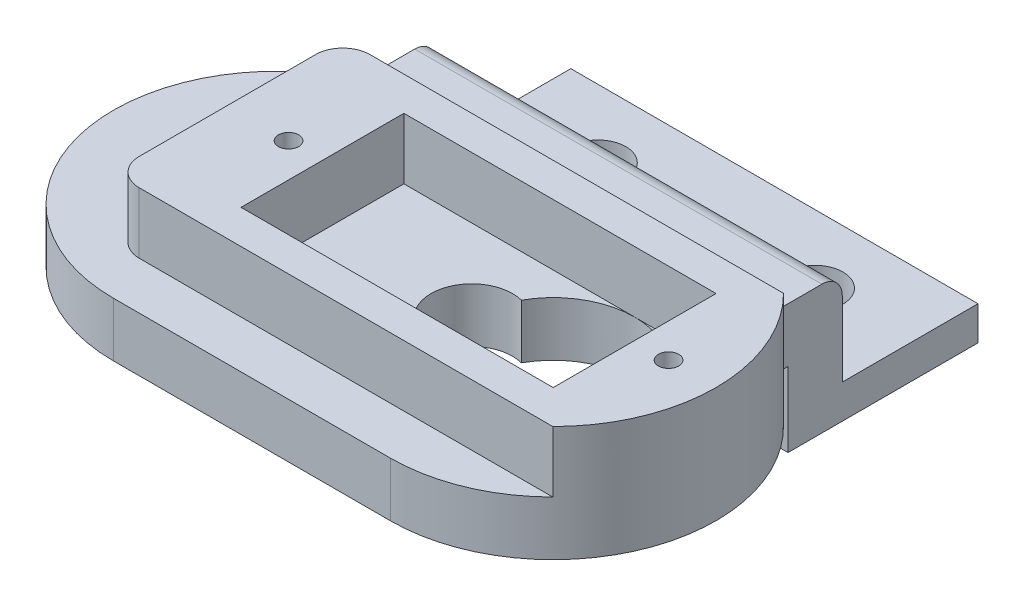
ISO-10303-21;
HEADER;
FILE_DESCRIPTION(('STEP AP214'),'2;1');
FILE_NAME('part.step','',(''),(''),'','','');
FILE_SCHEMA(('AUTOMOTIVE_DESIGN { 1 0 10303 214 1 1 1 1 }'));
ENDSEC;
DATA;
#1=APPLICATION_CONTEXT('core data for automotive mechanical design processes');
#2=APPLICATION_PROTOCOL_DEFINITION('international standard','automotive_design',2000,#1);
#3=PRODUCT_CONTEXT('',#1,'mechanical');
#4=PRODUCT('Part','Part','',(#3));
#5=PRODUCT_RELATED_PRODUCT_CATEGORY('part','',(#4));
#6=PRODUCT_DEFINITION_FORMATION('','',#4);
#7=PRODUCT_DEFINITION_CONTEXT('part definition',#1,'design');
#8=PRODUCT_DEFINITION('design','',#6,#7);
#9=PRODUCT_DEFINITION_SHAPE('','',#8);
#10=(LENGTH_UNIT() NAMED_UNIT(*) SI_UNIT(.MILLI.,.METRE.));
#11=(NAMED_UNIT(*) PLANE_ANGLE_UNIT() SI_UNIT($,.RADIAN.));
#12=(NAMED_UNIT(*) SI_UNIT($,.STERADIAN.) SOLID_ANGLE_UNIT());
#13=UNCERTAINTY_MEASURE_WITH_UNIT(LENGTH_MEASURE(1.E-05),#10,'distance_accuracy_value','');
#14=(GEOMETRIC_REPRESENTATION_CONTEXT(3) GLOBAL_UNCERTAINTY_ASSIGNED_CONTEXT((#13)) GLOBAL_UNIT_ASSIGNED_CONTEXT((#10,
#11,#12)) REPRESENTATION_CONTEXT('',''));
#15=CARTESIAN_POINT('',(0.,0.,0.));
#16=DIRECTION('',(0.,0.,1.));
#17=DIRECTION('',(1.,0.,0.));
#18=AXIS2_PLACEMENT_3D('',#15,#16,#17);
#19=CARTESIAN_POINT('',(0.,-5.5,0.));
#20=DIRECTION('',(0.,-1.,0.));
#21=DIRECTION('',(0.,0.,-1.));
#22=AXIS2_PLACEMENT_3D('',#19,#20,#21);
#23=PLANE('',#22);
#24=CARTESIAN_POINT('',(8.,-5.5,-21.5));
#25=DIRECTION('',(0.,-1.,0.));
#26=DIRECTION('',(0.,0.,-1.));
#27=AXIS2_PLACEMENT_3D('',#24,#25,#26);
#28=CIRCLE('',#27,2.05);
#29=CARTESIAN_POINT('',(8.,-5.5,-23.55));
#30=VERTEX_POINT('',#29);
#31=EDGE_CURVE('E862',#30,#30,#28,.F.);
#32=ORIENTED_EDGE('',*,*,#31,.T.);
#33=EDGE_LOOP('',(#32));
#34=FACE_BOUND('',#33,.T.);
#35=DIRECTION('',(1.,0.,0.));
#36=VECTOR('',#35,1.);
#37=CARTESIAN_POINT('',(0.,-5.5,-12.5));
#38=LINE('',#37,#36);
#39=CARTESIAN_POINT('',(-15.,-5.5,-12.5));
#40=VERTEX_POINT('',#39);
#41=CARTESIAN_POINT('',(15.,-5.5,-12.5));
#42=VERTEX_POINT('',#41);
#43=EDGE_CURVE('E236',#40,#42,#38,.T.);
#44=ORIENTED_EDGE('',*,*,#43,.F.);
#45=DIRECTION('',(0.,0.,-1.));
#46=VECTOR('',#45,1.);
#47=CARTESIAN_POINT('',(-15.,-5.5,0.));
#48=LINE('',#47,#46);
#49=CARTESIAN_POINT('',(-15.,-5.5,-26.5));
#50=VERTEX_POINT('',#49);
#51=EDGE_CURVE('E239',#40,#50,#48,.T.);
#52=ORIENTED_EDGE('',*,*,#51,.T.);
#53=DIRECTION('',(-1.,0.,0.));
#54=VECTOR('',#53,1.);
#55=CARTESIAN_POINT('',(0.,-5.5,-26.5));
#56=LINE('',#55,#54);
#57=CARTESIAN_POINT('',(15.,-5.5,-26.5));
#58=VERTEX_POINT('',#57);
#59=EDGE_CURVE('E221',#58,#50,#56,.T.);
#60=ORIENTED_EDGE('',*,*,#59,.F.);
#61=DIRECTION('',(0.,0.,1.));
#62=VECTOR('',#61,1.);
#63=CARTESIAN_POINT('',(15.,-5.5,0.));
#64=LINE('',#63,#62);
#65=EDGE_CURVE('E217',#58,#42,#64,.T.);
#66=ORIENTED_EDGE('',*,*,#65,.T.);
#67=EDGE_LOOP('',(#44,#52,#60,#66));
#68=FACE_BOUND('',#67,.T.);
#69=CARTESIAN_POINT('',(-8.,-5.5,-21.5));
#70=DIRECTION('',(0.,-1.,0.));
#71=DIRECTION('',(0.,0.,-1.));
#72=AXIS2_PLACEMENT_3D('',#69,#70,#71);
#73=CIRCLE('',#72,2.05);
#74=CARTESIAN_POINT('',(-8.,-5.5,-23.55));
#75=VERTEX_POINT('',#74);
#76=EDGE_CURVE('E228',#75,#75,#73,.T.);
#77=ORIENTED_EDGE('',*,*,#76,.F.);
#78=EDGE_LOOP('',(#77));
#79=FACE_BOUND('',#78,.T.);
#80=ADVANCED_FACE('F37',(#34,#68,#79),#23,.T.);
#81=CARTESIAN_POINT('',(0.,-3.,-26.5));
#82=DIRECTION('',(0.,1.,0.));
#83=DIRECTION('',(0.,0.,1.));
#84=AXIS2_PLACEMENT_3D('',#81,#82,#83);
#85=PLANE('',#84);
#86=CARTESIAN_POINT('',(8.,-3.,-21.5));
#87=DIRECTION('',(0.,-1.,0.));
#88=DIRECTION('',(0.,0.,-1.));
#89=AXIS2_PLACEMENT_3D('',#86,#87,#88);
#90=CIRCLE('',#89,2.05);
#91=CARTESIAN_POINT('',(8.,-3.,-23.55));
#92=VERTEX_POINT('',#91);
#93=EDGE_CURVE('E865',#92,#92,#90,.T.);
#94=ORIENTED_EDGE('',*,*,#93,.T.);
#95=EDGE_LOOP('',(#94));
#96=FACE_BOUND('',#95,.T.);
#97=DIRECTION('',(-1.,0.,0.));
#98=VECTOR('',#97,1.);
#99=CARTESIAN_POINT('',(0.,-3.,-16.5));
#100=LINE('',#99,#98);
#101=CARTESIAN_POINT('',(15.,-3.,-16.5));
#102=VERTEX_POINT('',#101);
#103=CARTESIAN_POINT('',(-15.,-3.,-16.5));
#104=VERTEX_POINT('',#103);
#105=EDGE_CURVE('E208',#102,#104,#100,.T.);
#106=ORIENTED_EDGE('',*,*,#105,.F.);
#107=DIRECTION('',(0.,0.,1.));
#108=VECTOR('',#107,1.);
#109=CARTESIAN_POINT('',(15.,-3.,-26.5));
#110=LINE('',#109,#108);
#111=CARTESIAN_POINT('',(15.,-3.,-26.5));
#112=VERTEX_POINT('',#111);
#113=EDGE_CURVE('E200',#112,#102,#110,.T.);
#114=ORIENTED_EDGE('',*,*,#113,.F.);
#115=DIRECTION('',(-1.,0.,0.));
#116=VECTOR('',#115,1.);
#117=CARTESIAN_POINT('',(0.,-3.,-26.5));
#118=LINE('',#117,#116);
#119=CARTESIAN_POINT('',(-15.,-3.,-26.5));
#120=VERTEX_POINT('',#119);
#121=EDGE_CURVE('E206',#112,#120,#118,.T.);
#122=ORIENTED_EDGE('',*,*,#121,.T.);
#123=DIRECTION('',(0.,0.,1.));
#124=VECTOR('',#123,1.);
#125=CARTESIAN_POINT('',(-15.,-3.,-26.5));
#126=LINE('',#125,#124);
#127=EDGE_CURVE('E211',#120,#104,#126,.T.);
#128=ORIENTED_EDGE('',*,*,#127,.T.);
#129=EDGE_LOOP('',(#106,#114,#122,#128));
#130=FACE_BOUND('',#129,.T.);
#131=CARTESIAN_POINT('',(-8.,-3.,-21.5));
#132=DIRECTION('',(0.,1.,0.));
#133=DIRECTION('',(0.,0.,1.));
#134=AXIS2_PLACEMENT_3D('',#131,#132,#133);
#135=CIRCLE('',#134,2.05);
#136=CARTESIAN_POINT('',(-8.,-3.,-19.45));
#137=VERTEX_POINT('',#136);
#138=EDGE_CURVE('E866',#137,#137,#135,.T.);
#139=ORIENTED_EDGE('',*,*,#138,.F.);
#140=EDGE_LOOP('',(#139));
#141=FACE_BOUND('',#140,.T.);
#142=ADVANCED_FACE('F202',(#96,#130,#141),#85,.T.);
#143=CARTESIAN_POINT('',(10.2,4.,0.));
#144=DIRECTION('',(0.,1.,0.));
#145=DIRECTION('',(0.,0.,1.));
#146=AXIS2_PLACEMENT_3D('',#143,#144,#145);
#147=PLANE('',#146);
#148=DIRECTION('',(-1.,0.,0.));
#149=VECTOR('',#148,1.);
#150=CARTESIAN_POINT('',(0.,4.,6.));
#151=LINE('',#150,#149);
#152=CARTESIAN_POINT('',(16.2,4.,6.));
#153=VERTEX_POINT('',#152);
#154=CARTESIAN_POINT('',(10.2,4.,6.));
#155=VERTEX_POINT('',#154);
#156=EDGE_CURVE('E300',#153,#155,#151,.T.);
#157=ORIENTED_EDGE('',*,*,#156,.F.);
#158=DIRECTION('',(0.,0.,-1.));
#159=VECTOR('',#158,1.);
#160=CARTESIAN_POINT('',(16.2,4.,0.));
#161=LINE('',#160,#159);
#162=CARTESIAN_POINT('',(16.2,4.,0.));
#163=VERTEX_POINT('',#162);
#164=EDGE_CURVE('E266',#153,#163,#161,.T.);
#165=ORIENTED_EDGE('',*,*,#164,.T.);
#166=CARTESIAN_POINT('',(10.2,4.,0.));
#167=DIRECTION('',(0.,-1.,0.));
#168=DIRECTION('',(0.,0.,-1.));
#169=AXIS2_PLACEMENT_3D('',#166,#167,#168);
#170=CIRCLE('',#169,6.);
#171=EDGE_CURVE('E446',#163,#155,#170,.T.);
#172=ORIENTED_EDGE('',*,*,#171,.T.);
#173=EDGE_LOOP('',(#157,#165,#172));
#174=FACE_BOUND('',#173,.T.);
#175=ADVANCED_FACE('F445',(#174),#147,.T.);
#176=CARTESIAN_POINT('',(10.2,4.,-6.));
#177=VERTEX_POINT('',#176);
#178=EDGE_CURVE('E347',#177,#163,#170,.T.);
#179=ORIENTED_EDGE('',*,*,#178,.T.);
#180=CARTESIAN_POINT('',(16.2,4.,-6.));
#181=VERTEX_POINT('',#180);
#182=EDGE_CURVE('E312',#163,#181,#161,.T.);
#183=ORIENTED_EDGE('',*,*,#182,.T.);
#184=DIRECTION('',(1.,0.,0.));
#185=VECTOR('',#184,1.);
#186=CARTESIAN_POINT('',(0.,4.,-6.));
#187=LINE('',#186,#185);
#188=EDGE_CURVE('E310',#177,#181,#187,.T.);
#189=ORIENTED_EDGE('',*,*,#188,.F.);
#190=EDGE_LOOP('',(#179,#183,#189));
#191=FACE_BOUND('',#190,.T.);
#192=ADVANCED_FACE('F450',(#191),#147,.T.);
#193=DIRECTION('',(0.,0.,-1.));
#194=VECTOR('',#193,1.);
#195=CARTESIAN_POINT('',(15.,4.,-10.998181667894));
#196=LINE('',#195,#194);
#197=CARTESIAN_POINT('',(15.,4.,-10.998181667894));
#198=VERTEX_POINT('',#197);
#199=CARTESIAN_POINT('',(15.,4.,-15.));
#200=VERTEX_POINT('',#199);
#201=EDGE_CURVE('E370',#198,#200,#196,.T.);
#202=ORIENTED_EDGE('',*,*,#201,.T.);
#203=DIRECTION('',(-1.,0.,0.));
#204=VECTOR('',#203,1.);
#205=CARTESIAN_POINT('',(-15.,4.,-15.));
#206=LINE('',#205,#204);
#207=CARTESIAN_POINT('',(-15.,4.,-15.));
#208=VERTEX_POINT('',#207);
#209=EDGE_CURVE('E414',#200,#208,#206,.T.);
#210=ORIENTED_EDGE('',*,*,#209,.T.);
#211=DIRECTION('',(0.,0.,1.));
#212=VECTOR('',#211,1.);
#213=CARTESIAN_POINT('',(-15.,4.,-10.998181667894));
#214=LINE('',#213,#212);
#215=CARTESIAN_POINT('',(-15.,4.,-10.998181667894));
#216=VERTEX_POINT('',#215);
#217=EDGE_CURVE('E374',#208,#216,#214,.T.);
#218=ORIENTED_EDGE('',*,*,#217,.T.);
#219=CARTESIAN_POINT('',(-10.2,4.,0.));
#220=DIRECTION('',(0.,1.,0.));
#221=DIRECTION('',(0.,0.,-1.));
#222=AXIS2_PLACEMENT_3D('',#219,#220,#221);
#223=CIRCLE('',#222,12.);
#224=CARTESIAN_POINT('',(-10.2,4.,12.));
#225=VERTEX_POINT('',#224);
#226=EDGE_CURVE('E376',#216,#225,#223,.T.);
#227=ORIENTED_EDGE('',*,*,#226,.T.);
#228=DIRECTION('',(1.,0.,0.));
#229=VECTOR('',#228,1.);
#230=CARTESIAN_POINT('',(-10.2,4.,12.));
#231=LINE('',#230,#229);
#232=CARTESIAN_POINT('',(10.2,4.,12.));
#233=VERTEX_POINT('',#232);
#234=EDGE_CURVE('E378',#225,#233,#231,.T.);
#235=ORIENTED_EDGE('',*,*,#234,.T.);
#236=CARTESIAN_POINT('',(10.2,4.,0.));
#237=DIRECTION('',(0.,1.,0.));
#238=DIRECTION('',(0.,0.,1.));
#239=AXIS2_PLACEMENT_3D('',#236,#237,#238);
#240=CIRCLE('',#239,12.);
#241=CARTESIAN_POINT('',(18.6705371730487,4.,8.5));
#242=VERTEX_POINT('',#241);
#243=EDGE_CURVE('E368',#233,#242,#240,.T.);
#244=ORIENTED_EDGE('',*,*,#243,.T.);
#245=DIRECTION('',(1.,0.,0.));
#246=VECTOR('',#245,1.);
#247=CARTESIAN_POINT('',(0.,4.,8.5));
#248=LINE('',#247,#246);
#249=CARTESIAN_POINT('',(-11.8,4.,8.5));
#250=VERTEX_POINT('',#249);
#251=EDGE_CURVE('E294',#250,#242,#248,.T.);
#252=ORIENTED_EDGE('',*,*,#251,.F.);
#253=CARTESIAN_POINT('',(-11.8,4.,6.5));
#254=DIRECTION('',(0.,1.,0.));
#255=DIRECTION('',(0.,0.,1.));
#256=AXIS2_PLACEMENT_3D('',#253,#254,#255);
#257=CIRCLE('',#256,2.);
#258=CARTESIAN_POINT('',(-13.8,4.,6.5));
#259=VERTEX_POINT('',#258);
#260=EDGE_CURVE('E291',#259,#250,#257,.T.);
#261=ORIENTED_EDGE('',*,*,#260,.F.);
#262=DIRECTION('',(0.,0.,1.));
#263=VECTOR('',#262,1.);
#264=CARTESIAN_POINT('',(-13.8,4.,0.));
#265=LINE('',#264,#263);
#266=CARTESIAN_POINT('',(-13.8,4.,-6.5));
#267=VERTEX_POINT('',#266);
#268=EDGE_CURVE('E288',#267,#259,#265,.T.);
#269=ORIENTED_EDGE('',*,*,#268,.F.);
#270=CARTESIAN_POINT('',(-11.8,4.,-6.5));
#271=DIRECTION('',(0.,1.,0.));
#272=DIRECTION('',(0.,0.,1.));
#273=AXIS2_PLACEMENT_3D('',#270,#271,#272);
#274=CIRCLE('',#273,2.);
#275=CARTESIAN_POINT('',(-11.8,4.,-8.5));
#276=VERTEX_POINT('',#275);
#277=EDGE_CURVE('E253',#267,#276,#274,.F.);
#278=ORIENTED_EDGE('',*,*,#277,.T.);
#279=DIRECTION('',(-1.,0.,0.));
#280=VECTOR('',#279,1.);
#281=CARTESIAN_POINT('',(0.,4.,-8.5));
#282=LINE('',#281,#280);
#283=CARTESIAN_POINT('',(18.6705371730487,4.,-8.50000000000001));
#284=VERTEX_POINT('',#283);
#285=EDGE_CURVE('E297',#284,#276,#282,.T.);
#286=ORIENTED_EDGE('',*,*,#285,.F.);
#287=EDGE_CURVE('E371',#284,#198,#240,.T.);
#288=ORIENTED_EDGE('',*,*,#287,.T.);
#289=EDGE_LOOP('',(#202,#210,#218,#227,#235,#244,#252,#261,#269,#278,#286,#288));
#290=FACE_BOUND('',#289,.T.);
#291=ADVANCED_FACE('F452',(#290),#147,.T.);
#292=CARTESIAN_POINT('',(-6.8,4.,6.));
#293=VERTEX_POINT('',#292);
#294=EDGE_CURVE('E304',#155,#293,#151,.T.);
#295=ORIENTED_EDGE('',*,*,#294,.F.);
#296=CARTESIAN_POINT('',(4.95,4.,2.90473750965556));
#297=VERTEX_POINT('',#296);
#298=EDGE_CURVE('E326',#155,#297,#170,.T.);
#299=ORIENTED_EDGE('',*,*,#298,.T.);
#300=CARTESIAN_POINT('',(4.2,4.,0.));
#301=DIRECTION('',(0.,1.,0.));
#302=DIRECTION('',(0.,0.,1.));
#303=AXIS2_PLACEMENT_3D('',#300,#301,#302);
#304=CIRCLE('',#303,3.);
#305=CARTESIAN_POINT('',(4.95,4.,-2.90473750965556));
#306=VERTEX_POINT('',#305);
#307=EDGE_CURVE('E346',#306,#297,#304,.T.);
#308=ORIENTED_EDGE('',*,*,#307,.F.);
#309=EDGE_CURVE('E343',#306,#177,#170,.T.);
#310=ORIENTED_EDGE('',*,*,#309,.T.);
#311=CARTESIAN_POINT('',(-6.8,4.,-6.));
#312=VERTEX_POINT('',#311);
#313=EDGE_CURVE('E307',#312,#177,#187,.T.);
#314=ORIENTED_EDGE('',*,*,#313,.F.);
#315=DIRECTION('',(0.,0.,-1.));
#316=VECTOR('',#315,1.);
#317=CARTESIAN_POINT('',(-6.8,4.,0.));
#318=LINE('',#317,#316);
#319=EDGE_CURVE('E303',#293,#312,#318,.T.);
#320=ORIENTED_EDGE('',*,*,#319,.F.);
#321=EDGE_LOOP('',(#295,#299,#308,#310,#314,#320));
#322=FACE_BOUND('',#321,.T.);
#323=ADVANCED_FACE('F458',(#322),#147,.T.);
#324=CARTESIAN_POINT('',(10.2,0.,0.));
#325=DIRECTION('',(0.,1.,0.));
#326=DIRECTION('',(0.,0.,1.));
#327=AXIS2_PLACEMENT_3D('',#324,#325,#326);
#328=PLANE('',#327);
#329=DIRECTION('',(0.,0.,1.));
#330=VECTOR('',#329,1.);
#331=CARTESIAN_POINT('',(-15.,0.,-10.998181667894));
#332=LINE('',#331,#330);
#333=CARTESIAN_POINT('',(-15.,0.,-12.5));
#334=VERTEX_POINT('',#333);
#335=CARTESIAN_POINT('',(-15.,0.,-10.998181667894));
#336=VERTEX_POINT('',#335);
#337=EDGE_CURVE('E386',#334,#336,#332,.T.);
#338=ORIENTED_EDGE('',*,*,#337,.F.);
#339=DIRECTION('',(1.,0.,0.));
#340=VECTOR('',#339,1.);
#341=CARTESIAN_POINT('',(0.,0.,-12.5));
#342=LINE('',#341,#340);
#343=CARTESIAN_POINT('',(15.,0.,-12.5));
#344=VERTEX_POINT('',#343);
#345=EDGE_CURVE('E210',#334,#344,#342,.T.);
#346=ORIENTED_EDGE('',*,*,#345,.T.);
#347=DIRECTION('',(0.,0.,-1.));
#348=VECTOR('',#347,1.);
#349=CARTESIAN_POINT('',(15.,0.,-10.998181667894));
#350=LINE('',#349,#348);
#351=CARTESIAN_POINT('',(15.,0.,-10.998181667894));
#352=VERTEX_POINT('',#351);
#353=EDGE_CURVE('E383',#352,#344,#350,.T.);
#354=ORIENTED_EDGE('',*,*,#353,.F.);
#355=CARTESIAN_POINT('',(10.2,0.,0.));
#356=DIRECTION('',(0.,1.,0.));
#357=DIRECTION('',(0.,0.,1.));
#358=AXIS2_PLACEMENT_3D('',#355,#356,#357);
#359=CIRCLE('',#358,12.);
#360=CARTESIAN_POINT('',(10.2,0.,12.));
#361=VERTEX_POINT('',#360);
#362=EDGE_CURVE('E367',#361,#352,#359,.T.);
#363=ORIENTED_EDGE('',*,*,#362,.F.);
#364=DIRECTION('',(1.,0.,0.));
#365=VECTOR('',#364,1.);
#366=CARTESIAN_POINT('',(-10.2,0.,12.));
#367=LINE('',#366,#365);
#368=CARTESIAN_POINT('',(-10.2,0.,12.));
#369=VERTEX_POINT('',#368);
#370=EDGE_CURVE('E390',#369,#361,#367,.T.);
#371=ORIENTED_EDGE('',*,*,#370,.F.);
#372=CARTESIAN_POINT('',(-10.2,0.,0.));
#373=DIRECTION('',(0.,1.,0.));
#374=DIRECTION('',(0.,0.,-1.));
#375=AXIS2_PLACEMENT_3D('',#372,#373,#374);
#376=CIRCLE('',#375,12.);
#377=EDGE_CURVE('E388',#336,#369,#376,.T.);
#378=ORIENTED_EDGE('',*,*,#377,.F.);
#379=EDGE_LOOP('',(#338,#346,#354,#363,#371,#378));
#380=FACE_BOUND('',#379,.T.);
#381=CARTESIAN_POINT('',(-10.2,0.,0.));
#382=DIRECTION('',(0.,1.,0.));
#383=DIRECTION('',(0.,0.,1.));
#384=AXIS2_PLACEMENT_3D('',#381,#382,#383);
#385=CIRCLE('',#384,3.75);
#386=CARTESIAN_POINT('',(-10.2,0.,3.75));
#387=VERTEX_POINT('',#386);
#388=EDGE_CURVE('E364',#387,#387,#385,.F.);
#389=ORIENTED_EDGE('',*,*,#388,.F.);
#390=EDGE_LOOP('',(#389));
#391=FACE_BOUND('',#390,.T.);
#392=CARTESIAN_POINT('',(10.2,0.,0.));
#393=DIRECTION('',(0.,1.,0.));
#394=DIRECTION('',(0.,0.,1.));
#395=AXIS2_PLACEMENT_3D('',#392,#393,#394);
#396=CIRCLE('',#395,6.);
#397=CARTESIAN_POINT('',(4.95,0.,-2.90473750965556));
#398=VERTEX_POINT('',#397);
#399=CARTESIAN_POINT('',(4.95,0.,2.90473750965556));
#400=VERTEX_POINT('',#399);
#401=EDGE_CURVE('E411',#398,#400,#396,.F.);
#402=ORIENTED_EDGE('',*,*,#401,.F.);
#403=CARTESIAN_POINT('',(4.2,0.,0.));
#404=DIRECTION('',(0.,1.,0.));
#405=DIRECTION('',(0.,0.,1.));
#406=AXIS2_PLACEMENT_3D('',#403,#404,#405);
#407=CIRCLE('',#406,3.);
#408=EDGE_CURVE('E363',#398,#400,#407,.T.);
#409=ORIENTED_EDGE('',*,*,#408,.T.);
#410=EDGE_LOOP('',(#402,#409));
#411=FACE_BOUND('',#410,.T.);
#412=ADVANCED_FACE('F556',(#380,#391,#411),#328,.F.);
#413=CARTESIAN_POINT('',(10.2,4.,0.));
#414=DIRECTION('',(0.,-1.,0.));
#415=DIRECTION('',(0.,0.,-1.));
#416=AXIS2_PLACEMENT_3D('',#413,#414,#415);
#417=CYLINDRICAL_SURFACE('',#416,12.);
#418=ORIENTED_EDGE('',*,*,#362,.T.);
#419=DIRECTION('',(0.,-1.,0.));
#420=VECTOR('',#419,1.);
#421=CARTESIAN_POINT('',(15.,4.,-10.998181667894));
#422=LINE('',#421,#420);
#423=EDGE_CURVE('E404',#198,#352,#422,.T.);
#424=ORIENTED_EDGE('',*,*,#423,.F.);
#425=ORIENTED_EDGE('',*,*,#287,.F.);
#426=DIRECTION('',(0.,-1.,0.));
#427=VECTOR('',#426,1.);
#428=CARTESIAN_POINT('',(18.6705371730487,8.5,-8.50000000000001));
#429=LINE('',#428,#427);
#430=CARTESIAN_POINT('',(18.6705371730487,8.5,-8.50000000000001));
#431=VERTEX_POINT('',#430);
#432=EDGE_CURVE('E329',#431,#284,#429,.T.);
#433=ORIENTED_EDGE('',*,*,#432,.F.);
#434=CARTESIAN_POINT('',(10.2,8.5,0.));
#435=DIRECTION('',(0.,1.,0.));
#436=DIRECTION('',(0.,0.,1.));
#437=AXIS2_PLACEMENT_3D('',#434,#435,#436);
#438=CIRCLE('',#437,12.);
#439=CARTESIAN_POINT('',(18.6705371730487,8.5,8.5));
#440=VERTEX_POINT('',#439);
#441=EDGE_CURVE('E272',#440,#431,#438,.T.);
#442=ORIENTED_EDGE('',*,*,#441,.F.);
#443=DIRECTION('',(0.,-1.,0.));
#444=VECTOR('',#443,1.);
#445=CARTESIAN_POINT('',(18.6705371730487,8.5,8.5));
#446=LINE('',#445,#444);
#447=EDGE_CURVE('E332',#440,#242,#446,.T.);
#448=ORIENTED_EDGE('',*,*,#447,.T.);
#449=ORIENTED_EDGE('',*,*,#243,.F.);
#450=DIRECTION('',(0.,-1.,0.));
#451=VECTOR('',#450,1.);
#452=CARTESIAN_POINT('',(10.2,4.,12.));
#453=LINE('',#452,#451);
#454=EDGE_CURVE('E380',#233,#361,#453,.T.);
#455=ORIENTED_EDGE('',*,*,#454,.T.);
#456=EDGE_LOOP('',(#418,#424,#425,#433,#442,#448,#449,#455));
#457=FACE_BOUND('',#456,.T.);
#458=ADVANCED_FACE('F559',(#457),#417,.T.);
#459=CARTESIAN_POINT('',(15.,4.,-10.998181667894));
#460=DIRECTION('',(-1.,0.,0.));
#461=DIRECTION('',(0.,0.,1.));
#462=AXIS2_PLACEMENT_3D('',#459,#460,#461);
#463=PLANE('',#462);
#464=DIRECTION('',(0.,-1.,0.));
#465=VECTOR('',#464,1.);
#466=CARTESIAN_POINT('',(15.,4.,-16.5));
#467=LINE('',#466,#465);
#468=CARTESIAN_POINT('',(15.,2.5,-16.5));
#469=VERTEX_POINT('',#468);
#470=EDGE_CURVE('E402',#469,#102,#467,.T.);
#471=ORIENTED_EDGE('',*,*,#470,.F.);
#472=CARTESIAN_POINT('',(15.,2.5,-15.));
#473=DIRECTION('',(-1.,0.,0.));
#474=DIRECTION('',(0.,0.,1.));
#475=AXIS2_PLACEMENT_3D('',#472,#473,#474);
#476=CIRCLE('',#475,1.5);
#477=EDGE_CURVE('E11',#469,#200,#476,.F.);
#478=ORIENTED_EDGE('',*,*,#477,.T.);
#479=ORIENTED_EDGE('',*,*,#201,.F.);
#480=ORIENTED_EDGE('',*,*,#423,.T.);
#481=ORIENTED_EDGE('',*,*,#353,.T.);
#482=DIRECTION('',(0.,1.,0.));
#483=VECTOR('',#482,1.);
#484=CARTESIAN_POINT('',(15.,-5.5,-12.5));
#485=LINE('',#484,#483);
#486=EDGE_CURVE('E242',#42,#344,#485,.T.);
#487=ORIENTED_EDGE('',*,*,#486,.F.);
#488=ORIENTED_EDGE('',*,*,#65,.F.);
#489=DIRECTION('',(0.,-1.,0.));
#490=VECTOR('',#489,1.);
#491=CARTESIAN_POINT('',(15.,0.,-26.5));
#492=LINE('',#491,#490);
#493=EDGE_CURVE('E214',#112,#58,#492,.T.);
#494=ORIENTED_EDGE('',*,*,#493,.F.);
#495=ORIENTED_EDGE('',*,*,#113,.T.);
#496=EDGE_LOOP('',(#471,#478,#479,#480,#481,#487,#488,#494,#495));
#497=FACE_BOUND('',#496,.T.);
#498=ADVANCED_FACE('F215',(#497),#463,.F.);
#499=CARTESIAN_POINT('',(-15.,4.,-16.5));
#500=DIRECTION('',(0.,0.,1.));
#501=DIRECTION('',(1.,0.,0.));
#502=AXIS2_PLACEMENT_3D('',#499,#500,#501);
#503=PLANE('',#502);
#504=DIRECTION('',(0.,-1.,0.));
#505=VECTOR('',#504,1.);
#506=CARTESIAN_POINT('',(-15.,4.,-16.5));
#507=LINE('',#506,#505);
#508=CARTESIAN_POINT('',(-15.,2.5,-16.5));
#509=VERTEX_POINT('',#508);
#510=EDGE_CURVE('E400',#509,#104,#507,.T.);
#511=ORIENTED_EDGE('',*,*,#510,.F.);
#512=DIRECTION('',(-1.,0.,0.));
#513=VECTOR('',#512,1.);
#514=CARTESIAN_POINT('',(15.,2.5,-16.5));
#515=LINE('',#514,#513);
#516=EDGE_CURVE('E45',#509,#469,#515,.F.);
#517=ORIENTED_EDGE('',*,*,#516,.T.);
#518=ORIENTED_EDGE('',*,*,#470,.T.);
#519=ORIENTED_EDGE('',*,*,#105,.T.);
#520=EDGE_LOOP('',(#511,#517,#518,#519));
#521=FACE_BOUND('',#520,.T.);
#522=ADVANCED_FACE('F588',(#521),#503,.F.);
#523=CARTESIAN_POINT('',(-15.,4.,-10.998181667894));
#524=DIRECTION('',(1.,0.,0.));
#525=DIRECTION('',(0.,0.,-1.));
#526=AXIS2_PLACEMENT_3D('',#523,#524,#525);
#527=PLANE('',#526);
#528=ORIENTED_EDGE('',*,*,#217,.F.);
#529=CARTESIAN_POINT('',(-15.,2.5,-15.));
#530=DIRECTION('',(1.,0.,0.));
#531=DIRECTION('',(0.,0.,-1.));
#532=AXIS2_PLACEMENT_3D('',#529,#530,#531);
#533=CIRCLE('',#532,1.5);
#534=EDGE_CURVE('E59',#208,#509,#533,.F.);
#535=ORIENTED_EDGE('',*,*,#534,.T.);
#536=ORIENTED_EDGE('',*,*,#510,.T.);
#537=ORIENTED_EDGE('',*,*,#127,.F.);
#538=DIRECTION('',(0.,1.,0.));
#539=VECTOR('',#538,1.);
#540=CARTESIAN_POINT('',(-15.,0.,-26.5));
#541=LINE('',#540,#539);
#542=EDGE_CURVE('E225',#50,#120,#541,.T.);
#543=ORIENTED_EDGE('',*,*,#542,.F.);
#544=ORIENTED_EDGE('',*,*,#51,.F.);
#545=DIRECTION('',(0.,1.,0.));
#546=VECTOR('',#545,1.);
#547=CARTESIAN_POINT('',(-15.,-5.5,-12.5));
#548=LINE('',#547,#546);
#549=EDGE_CURVE('E246',#40,#334,#548,.T.);
#550=ORIENTED_EDGE('',*,*,#549,.T.);
#551=ORIENTED_EDGE('',*,*,#337,.T.);
#552=DIRECTION('',(0.,-1.,0.));
#553=VECTOR('',#552,1.);
#554=CARTESIAN_POINT('',(-15.,4.,-10.998181667894));
#555=LINE('',#554,#553);
#556=EDGE_CURVE('E397',#216,#336,#555,.T.);
#557=ORIENTED_EDGE('',*,*,#556,.F.);
#558=EDGE_LOOP('',(#528,#535,#536,#537,#543,#544,#550,#551,#557));
#559=FACE_BOUND('',#558,.T.);
#560=ADVANCED_FACE('F595',(#559),#527,.F.);
#561=CARTESIAN_POINT('',(-10.2,4.,0.));
#562=DIRECTION('',(0.,-1.,0.));
#563=DIRECTION('',(0.,0.,-1.));
#564=AXIS2_PLACEMENT_3D('',#561,#562,#563);
#565=CYLINDRICAL_SURFACE('',#564,12.);
#566=ORIENTED_EDGE('',*,*,#377,.T.);
#567=DIRECTION('',(0.,-1.,0.));
#568=VECTOR('',#567,1.);
#569=CARTESIAN_POINT('',(-10.2,4.,12.));
#570=LINE('',#569,#568);
#571=EDGE_CURVE('E394',#225,#369,#570,.T.);
#572=ORIENTED_EDGE('',*,*,#571,.F.);
#573=ORIENTED_EDGE('',*,*,#226,.F.);
#574=ORIENTED_EDGE('',*,*,#556,.T.);
#575=EDGE_LOOP('',(#566,#572,#573,#574));
#576=FACE_BOUND('',#575,.T.);
#577=ADVANCED_FACE('F549',(#576),#565,.T.);
#578=CARTESIAN_POINT('',(-10.2,4.,12.));
#579=DIRECTION('',(0.,0.,-1.));
#580=DIRECTION('',(-1.,0.,0.));
#581=AXIS2_PLACEMENT_3D('',#578,#579,#580);
#582=PLANE('',#581);
#583=ORIENTED_EDGE('',*,*,#370,.T.);
#584=ORIENTED_EDGE('',*,*,#454,.F.);
#585=ORIENTED_EDGE('',*,*,#234,.F.);
#586=ORIENTED_EDGE('',*,*,#571,.T.);
#587=EDGE_LOOP('',(#583,#584,#585,#586));
#588=FACE_BOUND('',#587,.T.);
#589=ADVANCED_FACE('F544',(#588),#582,.F.);
#590=CARTESIAN_POINT('',(-10.2,-5.5,0.));
#591=DIRECTION('',(0.,1.,0.));
#592=DIRECTION('',(0.,0.,1.));
#593=AXIS2_PLACEMENT_3D('',#590,#591,#592);
#594=CYLINDRICAL_SURFACE('',#593,3.75);
#595=CARTESIAN_POINT('',(-10.2,-5.5,0.));
#596=DIRECTION('',(0.,-1.,0.));
#597=DIRECTION('',(0.,0.,-1.));
#598=AXIS2_PLACEMENT_3D('',#595,#596,#597);
#599=CIRCLE('',#598,3.75);
#600=CARTESIAN_POINT('',(-10.2,-5.5,-3.75));
#601=VERTEX_POINT('',#600);
#602=EDGE_CURVE('E359',#601,#601,#599,.T.);
#603=ORIENTED_EDGE('',*,*,#602,.F.);
#604=EDGE_LOOP('',(#603));
#605=FACE_BOUND('',#604,.T.);
#606=ORIENTED_EDGE('',*,*,#388,.T.);
#607=EDGE_LOOP('',(#606));
#608=FACE_BOUND('',#607,.T.);
#609=ADVANCED_FACE('F541',(#605,#608),#594,.T.);
#610=CARTESIAN_POINT('',(-10.2,-5.5,0.));
#611=DIRECTION('',(0.,-1.,0.));
#612=DIRECTION('',(0.,0.,-1.));
#613=AXIS2_PLACEMENT_3D('',#610,#611,#612);
#614=PLANE('',#613);
#615=CARTESIAN_POINT('',(-10.2,-5.5,0.));
#616=DIRECTION('',(0.,-1.,0.));
#617=DIRECTION('',(0.,0.,-1.));
#618=AXIS2_PLACEMENT_3D('',#615,#616,#617);
#619=CIRCLE('',#618,2.5);
#620=CARTESIAN_POINT('',(-10.2,-5.5,-2.5));
#621=VERTEX_POINT('',#620);
#622=EDGE_CURVE('E360',#621,#621,#619,.T.);
#623=ORIENTED_EDGE('',*,*,#622,.F.);
#624=EDGE_LOOP('',(#623));
#625=FACE_BOUND('',#624,.T.);
#626=ORIENTED_EDGE('',*,*,#602,.T.);
#627=EDGE_LOOP('',(#626));
#628=FACE_BOUND('',#627,.T.);
#629=ADVANCED_FACE('F538',(#625,#628),#614,.T.);
#630=CARTESIAN_POINT('',(-10.2,-7.5,0.));
#631=DIRECTION('',(0.,1.,0.));
#632=DIRECTION('',(0.,0.,1.));
#633=AXIS2_PLACEMENT_3D('',#630,#631,#632);
#634=CYLINDRICAL_SURFACE('',#633,2.5);
#635=CARTESIAN_POINT('',(-10.2,-7.5,0.));
#636=DIRECTION('',(0.,-1.,0.));
#637=DIRECTION('',(0.,0.,-1.));
#638=AXIS2_PLACEMENT_3D('',#635,#636,#637);
#639=CIRCLE('',#638,2.5);
#640=CARTESIAN_POINT('',(-10.2,-7.5,-2.5));
#641=VERTEX_POINT('',#640);
#642=EDGE_CURVE('E356',#641,#641,#639,.T.);
#643=ORIENTED_EDGE('',*,*,#642,.F.);
#644=EDGE_LOOP('',(#643));
#645=FACE_BOUND('',#644,.T.);
#646=ORIENTED_EDGE('',*,*,#622,.T.);
#647=EDGE_LOOP('',(#646));
#648=FACE_BOUND('',#647,.T.);
#649=ADVANCED_FACE('F534',(#645,#648),#634,.T.);
#650=CARTESIAN_POINT('',(-10.2,-7.5,0.));
#651=DIRECTION('',(0.,-1.,0.));
#652=DIRECTION('',(0.,0.,-1.));
#653=AXIS2_PLACEMENT_3D('',#650,#651,#652);
#654=PLANE('',#653);
#655=ORIENTED_EDGE('',*,*,#642,.T.);
#656=EDGE_LOOP('',(#655));
#657=FACE_BOUND('',#656,.T.);
#658=ADVANCED_FACE('F531',(#657),#654,.T.);
#659=CARTESIAN_POINT('',(10.2,-7.5,0.));
#660=DIRECTION('',(0.,1.,0.));
#661=DIRECTION('',(0.,0.,1.));
#662=AXIS2_PLACEMENT_3D('',#659,#660,#661);
#663=CYLINDRICAL_SURFACE('',#662,6.);
#664=ORIENTED_EDGE('',*,*,#401,.T.);
#665=DIRECTION('',(0.,1.,0.));
#666=VECTOR('',#665,1.);
#667=CARTESIAN_POINT('',(4.95,-7.5,2.90473750965556));
#668=LINE('',#667,#666);
#669=EDGE_CURVE('E353',#400,#297,#668,.T.);
#670=ORIENTED_EDGE('',*,*,#669,.T.);
#671=ORIENTED_EDGE('',*,*,#298,.F.);
#672=ORIENTED_EDGE('',*,*,#171,.F.);
#673=ORIENTED_EDGE('',*,*,#178,.F.);
#674=ORIENTED_EDGE('',*,*,#309,.F.);
#675=DIRECTION('',(0.,1.,0.));
#676=VECTOR('',#675,1.);
#677=CARTESIAN_POINT('',(4.95,-7.5,-2.90473750965556));
#678=LINE('',#677,#676);
#679=EDGE_CURVE('E350',#398,#306,#678,.T.);
#680=ORIENTED_EDGE('',*,*,#679,.F.);
#681=EDGE_LOOP('',(#664,#670,#671,#672,#673,#674,#680));
#682=FACE_BOUND('',#681,.T.);
#683=ADVANCED_FACE('F449',(#682),#663,.F.);
#684=CARTESIAN_POINT('',(4.2,-7.5,0.));
#685=DIRECTION('',(0.,1.,0.));
#686=DIRECTION('',(0.,0.,1.));
#687=AXIS2_PLACEMENT_3D('',#684,#685,#686);
#688=CYLINDRICAL_SURFACE('',#687,3.);
#689=ORIENTED_EDGE('',*,*,#679,.T.);
#690=ORIENTED_EDGE('',*,*,#307,.T.);
#691=ORIENTED_EDGE('',*,*,#669,.F.);
#692=ORIENTED_EDGE('',*,*,#408,.F.);
#693=EDGE_LOOP('',(#689,#690,#691,#692));
#694=FACE_BOUND('',#693,.T.);
#695=ADVANCED_FACE('F507',(#694),#688,.F.);
#696=CARTESIAN_POINT('',(0.,8.5,6.));
#697=DIRECTION('',(0.,0.,1.));
#698=DIRECTION('',(1.,0.,0.));
#699=AXIS2_PLACEMENT_3D('',#696,#697,#698);
#700=PLANE('',#699);
#701=ORIENTED_EDGE('',*,*,#156,.T.);
#702=ORIENTED_EDGE('',*,*,#294,.T.);
#703=DIRECTION('',(0.,-1.,0.));
#704=VECTOR('',#703,1.);
#705=CARTESIAN_POINT('',(-6.8,8.5,6.));
#706=LINE('',#705,#704);
#707=CARTESIAN_POINT('',(-6.8,8.5,6.));
#708=VERTEX_POINT('',#707);
#709=EDGE_CURVE('E323',#708,#293,#706,.T.);
#710=ORIENTED_EDGE('',*,*,#709,.F.);
#711=DIRECTION('',(-1.,0.,0.));
#712=VECTOR('',#711,1.);
#713=CARTESIAN_POINT('',(0.,8.5,6.));
#714=LINE('',#713,#712);
#715=CARTESIAN_POINT('',(16.2,8.5,6.));
#716=VERTEX_POINT('',#715);
#717=EDGE_CURVE('E276',#716,#708,#714,.T.);
#718=ORIENTED_EDGE('',*,*,#717,.F.);
#719=DIRECTION('',(0.,-1.,0.));
#720=VECTOR('',#719,1.);
#721=CARTESIAN_POINT('',(16.2,8.5,6.));
#722=LINE('',#721,#720);
#723=EDGE_CURVE('E313',#716,#153,#722,.T.);
#724=ORIENTED_EDGE('',*,*,#723,.T.);
#725=EDGE_LOOP('',(#701,#702,#710,#718,#724));
#726=FACE_BOUND('',#725,.T.);
#727=ADVANCED_FACE('F428',(#726),#700,.F.);
#728=CARTESIAN_POINT('',(-6.8,8.5,0.));
#729=DIRECTION('',(-1.,0.,0.));
#730=DIRECTION('',(0.,0.,1.));
#731=AXIS2_PLACEMENT_3D('',#728,#729,#730);
#732=PLANE('',#731);
#733=ORIENTED_EDGE('',*,*,#319,.T.);
#734=DIRECTION('',(0.,-1.,0.));
#735=VECTOR('',#734,1.);
#736=CARTESIAN_POINT('',(-6.8,8.5,-6.));
#737=LINE('',#736,#735);
#738=CARTESIAN_POINT('',(-6.8,8.5,-6.));
#739=VERTEX_POINT('',#738);
#740=EDGE_CURVE('E320',#739,#312,#737,.T.);
#741=ORIENTED_EDGE('',*,*,#740,.F.);
#742=DIRECTION('',(0.,0.,-1.));
#743=VECTOR('',#742,1.);
#744=CARTESIAN_POINT('',(-6.8,8.5,0.));
#745=LINE('',#744,#743);
#746=EDGE_CURVE('E279',#708,#739,#745,.T.);
#747=ORIENTED_EDGE('',*,*,#746,.F.);
#748=ORIENTED_EDGE('',*,*,#709,.T.);
#749=EDGE_LOOP('',(#733,#741,#747,#748));
#750=FACE_BOUND('',#749,.T.);
#751=ADVANCED_FACE('F433',(#750),#732,.F.);
#752=CARTESIAN_POINT('',(0.,8.5,-6.));
#753=DIRECTION('',(0.,0.,-1.));
#754=DIRECTION('',(-1.,0.,0.));
#755=AXIS2_PLACEMENT_3D('',#752,#753,#754);
#756=PLANE('',#755);
#757=ORIENTED_EDGE('',*,*,#313,.T.);
#758=ORIENTED_EDGE('',*,*,#188,.T.);
#759=DIRECTION('',(0.,-1.,0.));
#760=VECTOR('',#759,1.);
#761=CARTESIAN_POINT('',(16.2,8.5,-6.));
#762=LINE('',#761,#760);
#763=CARTESIAN_POINT('',(16.2,8.5,-6.));
#764=VERTEX_POINT('',#763);
#765=EDGE_CURVE('E316',#764,#181,#762,.T.);
#766=ORIENTED_EDGE('',*,*,#765,.F.);
#767=DIRECTION('',(1.,0.,0.));
#768=VECTOR('',#767,1.);
#769=CARTESIAN_POINT('',(0.,8.5,-6.));
#770=LINE('',#769,#768);
#771=EDGE_CURVE('E281',#739,#764,#770,.T.);
#772=ORIENTED_EDGE('',*,*,#771,.F.);
#773=ORIENTED_EDGE('',*,*,#740,.T.);
#774=EDGE_LOOP('',(#757,#758,#766,#772,#773));
#775=FACE_BOUND('',#774,.T.);
#776=ADVANCED_FACE('F499',(#775),#756,.F.);
#777=CARTESIAN_POINT('',(-11.8,8.5,-6.5));
#778=DIRECTION('',(0.,-1.,0.));
#779=DIRECTION('',(0.,0.,-1.));
#780=AXIS2_PLACEMENT_3D('',#777,#778,#779);
#781=CYLINDRICAL_SURFACE('',#780,2.);
#782=ORIENTED_EDGE('',*,*,#277,.F.);
#783=DIRECTION('',(0.,-1.,0.));
#784=VECTOR('',#783,1.);
#785=CARTESIAN_POINT('',(-13.8,8.5,-6.5));
#786=LINE('',#785,#784);
#787=CARTESIAN_POINT('',(-13.8,8.5,-6.5));
#788=VERTEX_POINT('',#787);
#789=EDGE_CURVE('E317',#788,#267,#786,.T.);
#790=ORIENTED_EDGE('',*,*,#789,.F.);
#791=CARTESIAN_POINT('',(-11.8,8.5,-6.5));
#792=DIRECTION('',(0.,1.,0.));
#793=DIRECTION('',(0.,0.,1.));
#794=AXIS2_PLACEMENT_3D('',#791,#792,#793);
#795=CIRCLE('',#794,2.);
#796=CARTESIAN_POINT('',(-11.8,8.5,-8.5));
#797=VERTEX_POINT('',#796);
#798=EDGE_CURVE('E262',#788,#797,#795,.F.);
#799=ORIENTED_EDGE('',*,*,#798,.T.);
#800=DIRECTION('',(0.,-1.,0.));
#801=VECTOR('',#800,1.);
#802=CARTESIAN_POINT('',(-11.8,8.5,-8.5));
#803=LINE('',#802,#801);
#804=EDGE_CURVE('E286',#797,#276,#803,.T.);
#805=ORIENTED_EDGE('',*,*,#804,.T.);
#806=EDGE_LOOP('',(#782,#790,#799,#805));
#807=FACE_BOUND('',#806,.T.);
#808=ADVANCED_FACE('F502',(#807),#781,.T.);
#809=CARTESIAN_POINT('',(-13.8,8.5,0.));
#810=DIRECTION('',(1.,0.,0.));
#811=DIRECTION('',(0.,0.,-1.));
#812=AXIS2_PLACEMENT_3D('',#809,#810,#811);
#813=PLANE('',#812);
#814=ORIENTED_EDGE('',*,*,#268,.T.);
#815=DIRECTION('',(0.,-1.,0.));
#816=VECTOR('',#815,1.);
#817=CARTESIAN_POINT('',(-13.8,8.5,6.5));
#818=LINE('',#817,#816);
#819=CARTESIAN_POINT('',(-13.8,8.5,6.5));
#820=VERTEX_POINT('',#819);
#821=EDGE_CURVE('E338',#820,#259,#818,.T.);
#822=ORIENTED_EDGE('',*,*,#821,.F.);
#823=DIRECTION('',(0.,0.,1.));
#824=VECTOR('',#823,1.);
#825=CARTESIAN_POINT('',(-13.8,8.5,0.));
#826=LINE('',#825,#824);
#827=EDGE_CURVE('E265',#788,#820,#826,.T.);
#828=ORIENTED_EDGE('',*,*,#827,.F.);
#829=ORIENTED_EDGE('',*,*,#789,.T.);
#830=EDGE_LOOP('',(#814,#822,#828,#829));
#831=FACE_BOUND('',#830,.T.);
#832=ADVANCED_FACE('F518',(#831),#813,.F.);
#833=CARTESIAN_POINT('',(-11.8,8.5,6.5));
#834=DIRECTION('',(0.,-1.,0.));
#835=DIRECTION('',(0.,0.,-1.));
#836=AXIS2_PLACEMENT_3D('',#833,#834,#835);
#837=CYLINDRICAL_SURFACE('',#836,2.);
#838=ORIENTED_EDGE('',*,*,#260,.T.);
#839=DIRECTION('',(0.,-1.,0.));
#840=VECTOR('',#839,1.);
#841=CARTESIAN_POINT('',(-11.8,8.5,8.5));
#842=LINE('',#841,#840);
#843=CARTESIAN_POINT('',(-11.8,8.5,8.5));
#844=VERTEX_POINT('',#843);
#845=EDGE_CURVE('E335',#844,#250,#842,.T.);
#846=ORIENTED_EDGE('',*,*,#845,.F.);
#847=CARTESIAN_POINT('',(-11.8,8.5,6.5));
#848=DIRECTION('',(0.,1.,0.));
#849=DIRECTION('',(0.,0.,1.));
#850=AXIS2_PLACEMENT_3D('',#847,#848,#849);
#851=CIRCLE('',#850,2.);
#852=EDGE_CURVE('E268',#820,#844,#851,.T.);
#853=ORIENTED_EDGE('',*,*,#852,.F.);
#854=ORIENTED_EDGE('',*,*,#821,.T.);
#855=EDGE_LOOP('',(#838,#846,#853,#854));
#856=FACE_BOUND('',#855,.T.);
#857=ADVANCED_FACE('F514',(#856),#837,.T.);
#858=CARTESIAN_POINT('',(0.,8.5,8.5));
#859=DIRECTION('',(0.,0.,-1.));
#860=DIRECTION('',(-1.,0.,0.));
#861=AXIS2_PLACEMENT_3D('',#858,#859,#860);
#862=PLANE('',#861);
#863=ORIENTED_EDGE('',*,*,#251,.T.);
#864=ORIENTED_EDGE('',*,*,#447,.F.);
#865=DIRECTION('',(1.,0.,0.));
#866=VECTOR('',#865,1.);
#867=CARTESIAN_POINT('',(0.,8.5,8.5));
#868=LINE('',#867,#866);
#869=EDGE_CURVE('E270',#844,#440,#868,.T.);
#870=ORIENTED_EDGE('',*,*,#869,.F.);
#871=ORIENTED_EDGE('',*,*,#845,.T.);
#872=EDGE_LOOP('',(#863,#864,#870,#871));
#873=FACE_BOUND('',#872,.T.);
#874=ADVANCED_FACE('F510',(#873),#862,.F.);
#875=CARTESIAN_POINT('',(0.,8.5,-8.5));
#876=DIRECTION('',(0.,0.,1.));
#877=DIRECTION('',(1.,0.,0.));
#878=AXIS2_PLACEMENT_3D('',#875,#876,#877);
#879=PLANE('',#878);
#880=ORIENTED_EDGE('',*,*,#285,.T.);
#881=ORIENTED_EDGE('',*,*,#804,.F.);
#882=DIRECTION('',(-1.,0.,0.));
#883=VECTOR('',#882,1.);
#884=CARTESIAN_POINT('',(0.,8.5,-8.5));
#885=LINE('',#884,#883);
#886=EDGE_CURVE('E274',#431,#797,#885,.T.);
#887=ORIENTED_EDGE('',*,*,#886,.F.);
#888=ORIENTED_EDGE('',*,*,#432,.T.);
#889=EDGE_LOOP('',(#880,#881,#887,#888));
#890=FACE_BOUND('',#889,.T.);
#891=ADVANCED_FACE('F498',(#890),#879,.F.);
#892=CARTESIAN_POINT('',(16.2,8.5,0.));
#893=DIRECTION('',(-1.,0.,0.));
#894=DIRECTION('',(0.,0.,1.));
#895=AXIS2_PLACEMENT_3D('',#892,#893,#894);
#896=PLANE('',#895);
#897=ORIENTED_EDGE('',*,*,#164,.F.);
#898=ORIENTED_EDGE('',*,*,#723,.F.);
#899=DIRECTION('',(0.,0.,-1.));
#900=VECTOR('',#899,1.);
#901=CARTESIAN_POINT('',(16.2,8.5,0.));
#902=LINE('',#901,#900);
#903=EDGE_CURVE('E283',#716,#764,#902,.T.);
#904=ORIENTED_EDGE('',*,*,#903,.T.);
#905=ORIENTED_EDGE('',*,*,#765,.T.);
#906=ORIENTED_EDGE('',*,*,#182,.F.);
#907=EDGE_LOOP('',(#897,#898,#904,#905,#906));
#908=FACE_BOUND('',#907,.T.);
#909=ADVANCED_FACE('F441',(#908),#896,.T.);
#910=CARTESIAN_POINT('',(0.,8.5,0.));
#911=DIRECTION('',(0.,1.,0.));
#912=DIRECTION('',(0.,0.,1.));
#913=AXIS2_PLACEMENT_3D('',#910,#911,#912);
#914=PLANE('',#913);
#915=CARTESIAN_POINT('',(-9.3,8.5,0.));
#916=DIRECTION('',(0.,1.,0.));
#917=DIRECTION('',(0.,0.,1.));
#918=AXIS2_PLACEMENT_3D('',#915,#916,#917);
#919=CIRCLE('',#918,0.75);
#920=CARTESIAN_POINT('',(-9.3,8.5,0.75));
#921=VERTEX_POINT('',#920);
#922=EDGE_CURVE('E254',#921,#921,#919,.T.);
#923=ORIENTED_EDGE('',*,*,#922,.F.);
#924=EDGE_LOOP('',(#923));
#925=FACE_BOUND('',#924,.T.);
#926=CARTESIAN_POINT('',(18.7,8.5,0.));
#927=DIRECTION('',(0.,1.,0.));
#928=DIRECTION('',(0.,0.,1.));
#929=AXIS2_PLACEMENT_3D('',#926,#927,#928);
#930=CIRCLE('',#929,0.750000000000002);
#931=CARTESIAN_POINT('',(18.7,8.5,0.750000000000002));
#932=VERTEX_POINT('',#931);
#933=EDGE_CURVE('E257',#932,#932,#930,.T.);
#934=ORIENTED_EDGE('',*,*,#933,.F.);
#935=EDGE_LOOP('',(#934));
#936=FACE_BOUND('',#935,.T.);
#937=ORIENTED_EDGE('',*,*,#798,.F.);
#938=ORIENTED_EDGE('',*,*,#827,.T.);
#939=ORIENTED_EDGE('',*,*,#852,.T.);
#940=ORIENTED_EDGE('',*,*,#869,.T.);
#941=ORIENTED_EDGE('',*,*,#441,.T.);
#942=ORIENTED_EDGE('',*,*,#886,.T.);
#943=EDGE_LOOP('',(#937,#938,#939,#940,#941,#942));
#944=FACE_BOUND('',#943,.T.);
#945=ORIENTED_EDGE('',*,*,#717,.T.);
#946=ORIENTED_EDGE('',*,*,#746,.T.);
#947=ORIENTED_EDGE('',*,*,#771,.T.);
#948=ORIENTED_EDGE('',*,*,#903,.F.);
#949=EDGE_LOOP('',(#945,#946,#947,#948));
#950=FACE_BOUND('',#949,.T.);
#951=ADVANCED_FACE('F438',(#925,#936,#944,#950),#914,.T.);
#952=CARTESIAN_POINT('',(18.7,0.5,0.));
#953=DIRECTION('',(0.,1.,0.));
#954=DIRECTION('',(0.,0.,1.));
#955=AXIS2_PLACEMENT_3D('',#952,#953,#954);
#956=CYLINDRICAL_SURFACE('',#955,0.750000000000002);
#957=CARTESIAN_POINT('',(18.7,0.5,0.));
#958=DIRECTION('',(0.,1.,0.));
#959=DIRECTION('',(0.,0.,1.));
#960=AXIS2_PLACEMENT_3D('',#957,#958,#959);
#961=CIRCLE('',#960,0.750000000000002);
#962=CARTESIAN_POINT('',(18.7,0.5,0.750000000000002));
#963=VERTEX_POINT('',#962);
#964=EDGE_CURVE('E249',#963,#963,#961,.T.);
#965=ORIENTED_EDGE('',*,*,#964,.F.);
#966=EDGE_LOOP('',(#965));
#967=FACE_BOUND('',#966,.T.);
#968=ORIENTED_EDGE('',*,*,#933,.T.);
#969=EDGE_LOOP('',(#968));
#970=FACE_BOUND('',#969,.T.);
#971=ADVANCED_FACE('F486',(#967,#970),#956,.F.);
#972=CARTESIAN_POINT('',(18.7,0.5,0.));
#973=DIRECTION('',(0.,1.,0.));
#974=DIRECTION('',(0.,0.,1.));
#975=AXIS2_PLACEMENT_3D('',#972,#973,#974);
#976=PLANE('',#975);
#977=ORIENTED_EDGE('',*,*,#964,.T.);
#978=EDGE_LOOP('',(#977));
#979=FACE_BOUND('',#978,.T.);
#980=ADVANCED_FACE('F484',(#979),#976,.T.);
#981=CARTESIAN_POINT('',(-9.3,0.5,0.));
#982=DIRECTION('',(0.,1.,0.));
#983=DIRECTION('',(0.,0.,1.));
#984=AXIS2_PLACEMENT_3D('',#981,#982,#983);
#985=CYLINDRICAL_SURFACE('',#984,0.75);
#986=CARTESIAN_POINT('',(-9.3,0.5,0.));
#987=DIRECTION('',(0.,1.,0.));
#988=DIRECTION('',(0.,0.,1.));
#989=AXIS2_PLACEMENT_3D('',#986,#987,#988);
#990=CIRCLE('',#989,0.75);
#991=CARTESIAN_POINT('',(-9.3,0.5,0.75));
#992=VERTEX_POINT('',#991);
#993=EDGE_CURVE('E250',#992,#992,#990,.T.);
#994=ORIENTED_EDGE('',*,*,#993,.F.);
#995=EDGE_LOOP('',(#994));
#996=FACE_BOUND('',#995,.T.);
#997=ORIENTED_EDGE('',*,*,#922,.T.);
#998=EDGE_LOOP('',(#997));
#999=FACE_BOUND('',#998,.T.);
#1000=ADVANCED_FACE('F480',(#996,#999),#985,.F.);
#1001=CARTESIAN_POINT('',(0.,0.5,0.));
#1002=DIRECTION('',(0.,1.,0.));
#1003=DIRECTION('',(0.,0.,1.));
#1004=AXIS2_PLACEMENT_3D('',#1001,#1002,#1003);
#1005=PLANE('',#1004);
#1006=ORIENTED_EDGE('',*,*,#993,.T.);
#1007=EDGE_LOOP('',(#1006));
#1008=FACE_BOUND('',#1007,.T.);
#1009=ADVANCED_FACE('F476',(#1008),#1005,.T.);
#1010=CARTESIAN_POINT('',(0.,-5.5,-12.5));
#1011=DIRECTION('',(0.,0.,1.));
#1012=DIRECTION('',(1.,0.,0.));
#1013=AXIS2_PLACEMENT_3D('',#1010,#1011,#1012);
#1014=PLANE('',#1013);
#1015=ORIENTED_EDGE('',*,*,#345,.F.);
#1016=ORIENTED_EDGE('',*,*,#549,.F.);
#1017=ORIENTED_EDGE('',*,*,#43,.T.);
#1018=ORIENTED_EDGE('',*,*,#486,.T.);
#1019=EDGE_LOOP('',(#1015,#1016,#1017,#1018));
#1020=FACE_BOUND('',#1019,.T.);
#1021=ADVANCED_FACE('F473',(#1020),#1014,.T.);
#1022=CARTESIAN_POINT('',(0.,0.,-26.5));
#1023=DIRECTION('',(0.,0.,-1.));
#1024=DIRECTION('',(-1.,0.,0.));
#1025=AXIS2_PLACEMENT_3D('',#1022,#1023,#1024);
#1026=PLANE('',#1025);
#1027=ORIENTED_EDGE('',*,*,#121,.F.);
#1028=ORIENTED_EDGE('',*,*,#493,.T.);
#1029=ORIENTED_EDGE('',*,*,#59,.T.);
#1030=ORIENTED_EDGE('',*,*,#542,.T.);
#1031=EDGE_LOOP('',(#1027,#1028,#1029,#1030));
#1032=FACE_BOUND('',#1031,.T.);
#1033=ADVANCED_FACE('F223',(#1032),#1026,.T.);
#1034=CARTESIAN_POINT('',(8.,-7.5,-21.5));
#1035=DIRECTION('',(0.,1.,0.));
#1036=DIRECTION('',(0.,0.,1.));
#1037=AXIS2_PLACEMENT_3D('',#1034,#1035,#1036);
#1038=CYLINDRICAL_SURFACE('',#1037,2.05);
#1039=ORIENTED_EDGE('',*,*,#31,.F.);
#1040=EDGE_LOOP('',(#1039));
#1041=FACE_BOUND('',#1040,.T.);
#1042=ORIENTED_EDGE('',*,*,#93,.F.);
#1043=EDGE_LOOP('',(#1042));
#1044=FACE_BOUND('',#1043,.T.);
#1045=ADVANCED_FACE('F668',(#1041,#1044),#1038,.F.);
#1046=CARTESIAN_POINT('',(-8.,-7.5,-21.5));
#1047=DIRECTION('',(0.,1.,0.));
#1048=DIRECTION('',(0.,0.,1.));
#1049=AXIS2_PLACEMENT_3D('',#1046,#1047,#1048);
#1050=CYLINDRICAL_SURFACE('',#1049,2.05);
#1051=ORIENTED_EDGE('',*,*,#76,.T.);
#1052=EDGE_LOOP('',(#1051));
#1053=FACE_BOUND('',#1052,.T.);
#1054=ORIENTED_EDGE('',*,*,#138,.T.);
#1055=EDGE_LOOP('',(#1054));
#1056=FACE_BOUND('',#1055,.T.);
#1057=ADVANCED_FACE('F663',(#1053,#1056),#1050,.F.);
#1058=CARTESIAN_POINT('',(10.2,2.5,-15.));
#1059=DIRECTION('',(1.,0.,0.));
#1060=DIRECTION('',(0.,0.,-1.));
#1061=AXIS2_PLACEMENT_3D('',#1058,#1059,#1060);
#1062=CYLINDRICAL_SURFACE('',#1061,1.5);
#1063=ORIENTED_EDGE('',*,*,#477,.F.);
#1064=ORIENTED_EDGE('',*,*,#516,.F.);
#1065=ORIENTED_EDGE('',*,*,#534,.F.);
#1066=ORIENTED_EDGE('',*,*,#209,.F.);
#1067=EDGE_LOOP('',(#1063,#1064,#1065,#1066));
#1068=FACE_BOUND('',#1067,.T.);
#1069=ADVANCED_FACE('F39',(#1068),#1062,.T.);
#1070=CLOSED_SHELL('',(#80,#142,#175,#192,#291,#323,#412,#458,#498,#522,#560,#577,#589,#609,
#629,#649,#658,#683,#695,#727,#751,#776,#808,#832,#857,#874,#891,#909,#951,#971,#980,#1000,
#1009,#1021,#1033,#1045,#1057,#1069));
#1071=MANIFOLD_SOLID_BREP('B2',#1070);
#1072=ADVANCED_BREP_SHAPE_REPRESENTATION('',(#18,#1071),#14);
#1073=SHAPE_DEFINITION_REPRESENTATION(#9,#1072);
ENDSEC;
END-ISO-10303-21;
